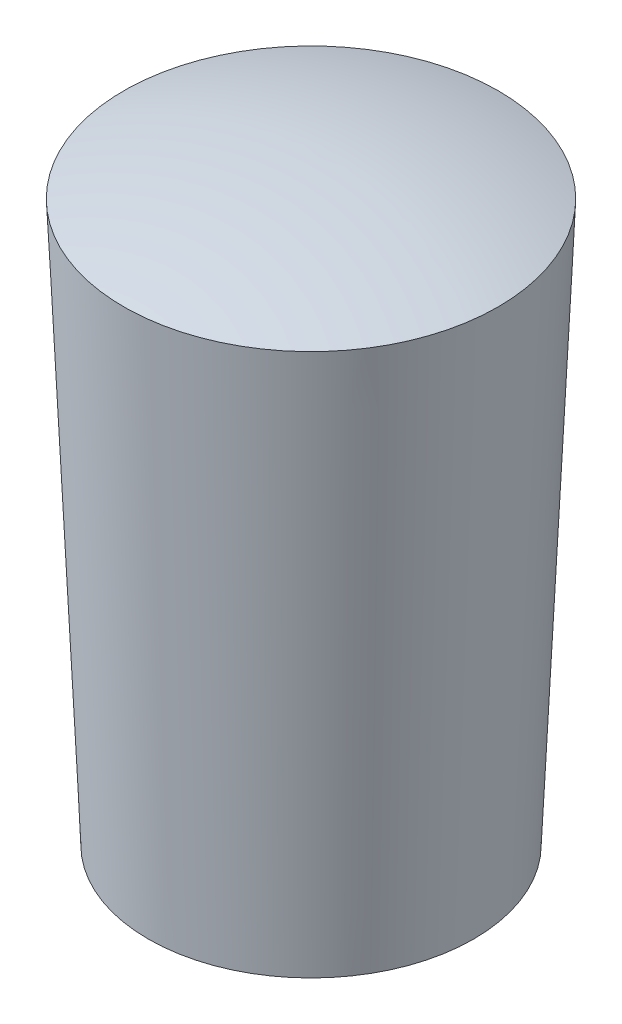
ISO-10303-21;
HEADER;
FILE_DESCRIPTION(('STEP AP214'),'2;1');
FILE_NAME('part.step','',(''),(''),'','','');
FILE_SCHEMA(('AUTOMOTIVE_DESIGN { 1 0 10303 214 1 1 1 1 }'));
ENDSEC;
DATA;
#1=APPLICATION_CONTEXT('core data for automotive mechanical design processes');
#2=APPLICATION_PROTOCOL_DEFINITION('international standard','automotive_design',2000,#1);
#3=PRODUCT_CONTEXT('',#1,'mechanical');
#4=PRODUCT('Part','Part','',(#3));
#5=PRODUCT_RELATED_PRODUCT_CATEGORY('part','',(#4));
#6=PRODUCT_DEFINITION_FORMATION('','',#4);
#7=PRODUCT_DEFINITION_CONTEXT('part definition',#1,'design');
#8=PRODUCT_DEFINITION('design','',#6,#7);
#9=PRODUCT_DEFINITION_SHAPE('','',#8);
#10=(LENGTH_UNIT() NAMED_UNIT(*) SI_UNIT(.MILLI.,.METRE.));
#11=(NAMED_UNIT(*) PLANE_ANGLE_UNIT() SI_UNIT($,.RADIAN.));
#12=(NAMED_UNIT(*) SI_UNIT($,.STERADIAN.) SOLID_ANGLE_UNIT());
#13=UNCERTAINTY_MEASURE_WITH_UNIT(LENGTH_MEASURE(1.E-05),#10,'distance_accuracy_value','');
#14=(GEOMETRIC_REPRESENTATION_CONTEXT(3) GLOBAL_UNCERTAINTY_ASSIGNED_CONTEXT((#13)) GLOBAL_UNIT_ASSIGNED_CONTEXT((#10,
#11,#12)) REPRESENTATION_CONTEXT('',''));
#15=CARTESIAN_POINT('',(0.,0.,0.));
#16=DIRECTION('',(0.,0.,1.));
#17=DIRECTION('',(1.,0.,0.));
#18=AXIS2_PLACEMENT_3D('',#15,#16,#17);
#19=CARTESIAN_POINT('',(0.,0.,0.));
#20=DIRECTION('',(0.,-1.,0.));
#21=DIRECTION('',(1.,0.,0.));
#22=AXIS2_PLACEMENT_3D('',#19,#20,#21);
#23=SPHERICAL_SURFACE('',#22,30.55);
#24=CARTESIAN_POINT('',(0.,28.9725219372231,0.));
#25=DIRECTION('',(0.,-1.,0.));
#26=DIRECTION('',(0.,0.,-1.));
#27=AXIS2_PLACEMENT_3D('',#24,#25,#26);
#28=CIRCLE('',#27,9.6899676262165);
#29=CARTESIAN_POINT('',(0.,28.9725219372231,-9.6899676262165));
#30=VERTEX_POINT('',#29);
#31=EDGE_CURVE('E61',#30,#30,#28,.T.);
#32=ORIENTED_EDGE('',*,*,#31,.F.);
#33=EDGE_LOOP('',(#32));
#34=FACE_BOUND('',#33,.T.);
#35=ADVANCED_FACE('F47',(#34),#23,.T.);
#36=CARTESIAN_POINT('',(0.,0.,0.));
#37=DIRECTION('',(0.,-1.,0.));
#38=DIRECTION('',(1.,0.,0.));
#39=AXIS2_PLACEMENT_3D('',#36,#37,#38);
#40=SPHERICAL_SURFACE('',#39,29.7);
#41=CARTESIAN_POINT('',(0.,28.3624655548854,0.));
#42=DIRECTION('',(0.,-1.,0.));
#43=DIRECTION('',(0.,0.,-1.));
#44=AXIS2_PLACEMENT_3D('',#41,#42,#43);
#45=CIRCLE('',#44,8.81252220694746);
#46=CARTESIAN_POINT('',(0.,28.3624655548854,-8.81252220694746));
#47=VERTEX_POINT('',#46);
#48=EDGE_CURVE('E12',#47,#47,#45,.T.);
#49=ORIENTED_EDGE('',*,*,#48,.T.);
#50=EDGE_LOOP('',(#49));
#51=FACE_BOUND('',#50,.T.);
#52=ADVANCED_FACE('F71',(#51),#40,.F.);
#53=CARTESIAN_POINT('',(0.,0.0370764792605206,0.));
#54=DIRECTION('',(0.,1.,0.));
#55=DIRECTION('',(0.,0.,1.));
#56=AXIS2_PLACEMENT_3D('',#53,#54,#55);
#57=CONICAL_SURFACE('',#56,7.57580901165542,0.043633231299851);
#58=ORIENTED_EDGE('',*,*,#48,.F.);
#59=EDGE_LOOP('',(#58));
#60=FACE_BOUND('',#59,.T.);
#61=CARTESIAN_POINT('',(0.,0.0370764792605206,0.));
#62=DIRECTION('',(0.,-1.,0.));
#63=DIRECTION('',(0.,0.,-1.));
#64=AXIS2_PLACEMENT_3D('',#61,#62,#63);
#65=CIRCLE('',#64,7.57580901165542);
#66=CARTESIAN_POINT('',(0.,0.0370764792605206,-7.57580901165542));
#67=VERTEX_POINT('',#66);
#68=EDGE_CURVE('E53',#67,#67,#65,.T.);
#69=ORIENTED_EDGE('',*,*,#68,.T.);
#70=EDGE_LOOP('',(#69));
#71=FACE_BOUND('',#70,.T.);
#72=ADVANCED_FACE('F75',(#60,#71),#57,.F.);
#73=CARTESIAN_POINT('',(0.,0.,0.));
#74=DIRECTION('',(0.,-1.,0.));
#75=DIRECTION('',(0.,0.,-1.));
#76=AXIS2_PLACEMENT_3D('',#73,#74,#75);
#77=CONICAL_SURFACE('',#76,8.425,1.52716309549506);
#78=ORIENTED_EDGE('',*,*,#68,.F.);
#79=EDGE_LOOP('',(#78));
#80=FACE_BOUND('',#79,.T.);
#81=CARTESIAN_POINT('',(0.,0.,0.));
#82=DIRECTION('',(0.,-1.,0.));
#83=DIRECTION('',(0.,0.,-1.));
#84=AXIS2_PLACEMENT_3D('',#81,#82,#83);
#85=CIRCLE('',#84,8.425);
#86=CARTESIAN_POINT('',(0.,0.,-8.425));
#87=VERTEX_POINT('',#86);
#88=EDGE_CURVE('E57',#87,#87,#85,.T.);
#89=ORIENTED_EDGE('',*,*,#88,.T.);
#90=EDGE_LOOP('',(#89));
#91=FACE_BOUND('',#90,.T.);
#92=ADVANCED_FACE('F79',(#80,#91),#77,.F.);
#93=CARTESIAN_POINT('',(0.,0.,0.));
#94=DIRECTION('',(0.,1.,0.));
#95=DIRECTION('',(0.,0.,1.));
#96=AXIS2_PLACEMENT_3D('',#93,#94,#95);
#97=CONICAL_SURFACE('',#96,8.425,0.043633231299851);
#98=ORIENTED_EDGE('',*,*,#31,.T.);
#99=EDGE_LOOP('',(#98));
#100=FACE_BOUND('',#99,.T.);
#101=ORIENTED_EDGE('',*,*,#88,.F.);
#102=EDGE_LOOP('',(#101));
#103=FACE_BOUND('',#102,.T.);
#104=ADVANCED_FACE('F67',(#100,#103),#97,.T.);
#105=CLOSED_SHELL('',(#35,#52,#72,#92,#104));
#106=MANIFOLD_SOLID_BREP('B2',#105);
#107=ADVANCED_BREP_SHAPE_REPRESENTATION('',(#18,#106),#14);
#108=SHAPE_DEFINITION_REPRESENTATION(#9,#107);
ENDSEC;
END-ISO-10303-21;
